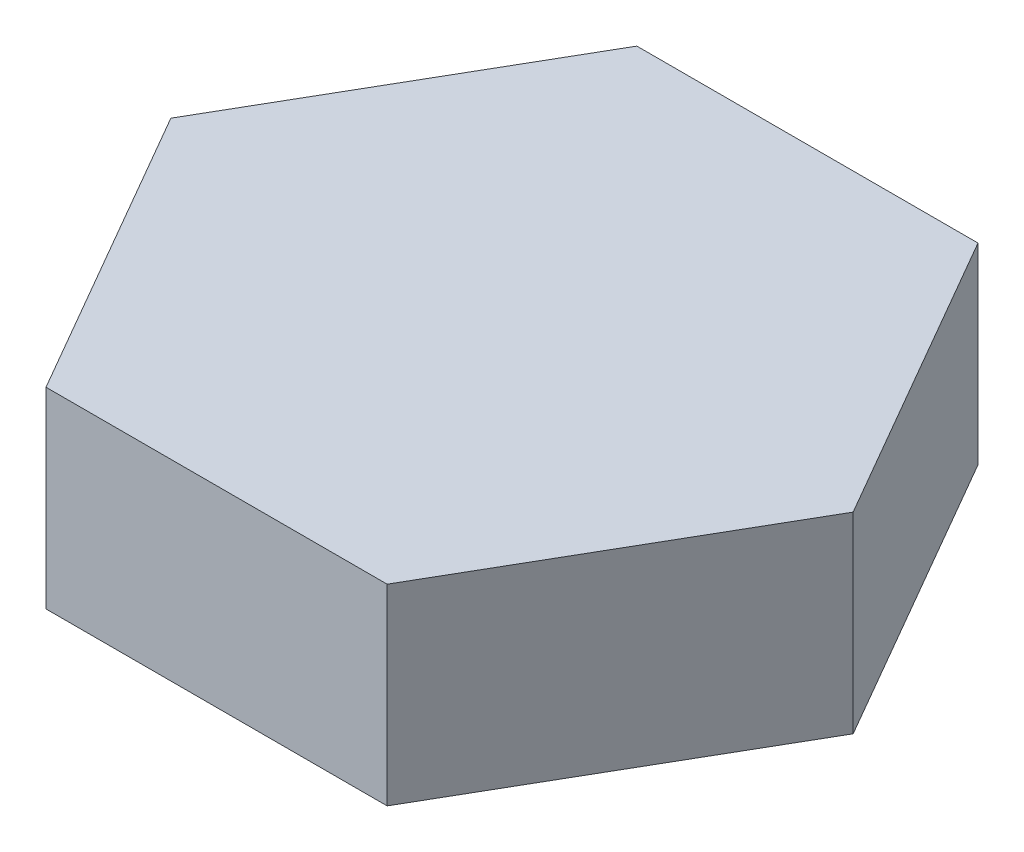
ISO-10303-21;
HEADER;
FILE_DESCRIPTION(('STEP AP214'),'2;1');
FILE_NAME('part.step','',(''),(''),'','','');
FILE_SCHEMA(('AUTOMOTIVE_DESIGN { 1 0 10303 214 1 1 1 1 }'));
ENDSEC;
DATA;
#1=APPLICATION_CONTEXT('core data for automotive mechanical design processes');
#2=APPLICATION_PROTOCOL_DEFINITION('international standard','automotive_design',2000,#1);
#3=PRODUCT_CONTEXT('',#1,'mechanical');
#4=PRODUCT('Part','Part','',(#3));
#5=PRODUCT_RELATED_PRODUCT_CATEGORY('part','',(#4));
#6=PRODUCT_DEFINITION_FORMATION('','',#4);
#7=PRODUCT_DEFINITION_CONTEXT('part definition',#1,'design');
#8=PRODUCT_DEFINITION('design','',#6,#7);
#9=PRODUCT_DEFINITION_SHAPE('','',#8);
#10=(LENGTH_UNIT() NAMED_UNIT(*) SI_UNIT(.MILLI.,.METRE.));
#11=(NAMED_UNIT(*) PLANE_ANGLE_UNIT() SI_UNIT($,.RADIAN.));
#12=(NAMED_UNIT(*) SI_UNIT($,.STERADIAN.) SOLID_ANGLE_UNIT());
#13=UNCERTAINTY_MEASURE_WITH_UNIT(LENGTH_MEASURE(1.E-05),#10,'distance_accuracy_value','');
#14=(GEOMETRIC_REPRESENTATION_CONTEXT(3) GLOBAL_UNCERTAINTY_ASSIGNED_CONTEXT((#13)) GLOBAL_UNIT_ASSIGNED_CONTEXT((#10,
#11,#12)) REPRESENTATION_CONTEXT('',''));
#15=CARTESIAN_POINT('',(0.,0.,0.));
#16=DIRECTION('',(0.,0.,1.));
#17=DIRECTION('',(1.,0.,0.));
#18=AXIS2_PLACEMENT_3D('',#15,#16,#17);
#19=CARTESIAN_POINT('',(29.3293936748329,16.51,50.8));
#20=DIRECTION('',(-0.866025403784438,0.,-0.500000000000001));
#21=DIRECTION('',(-0.500000000000001,0.,0.866025403784438));
#22=AXIS2_PLACEMENT_3D('',#19,#20,#21);
#23=PLANE('',#22);
#24=DIRECTION('',(0.500000000000001,0.,-0.866025403784438));
#25=VECTOR('',#24,1.);
#26=CARTESIAN_POINT('',(29.3293936748329,-16.51,50.8));
#27=LINE('',#26,#25);
#28=CARTESIAN_POINT('',(29.3293936748329,-16.51,50.8));
#29=VERTEX_POINT('',#28);
#30=CARTESIAN_POINT('',(58.658787349666,-16.51,0.));
#31=VERTEX_POINT('',#30);
#32=EDGE_CURVE('E117',#29,#31,#27,.T.);
#33=ORIENTED_EDGE('',*,*,#32,.T.);
#34=DIRECTION('',(0.,-1.,0.));
#35=VECTOR('',#34,1.);
#36=CARTESIAN_POINT('',(58.658787349666,16.51,0.));
#37=LINE('',#36,#35);
#38=CARTESIAN_POINT('',(58.658787349666,16.51,0.));
#39=VERTEX_POINT('',#38);
#40=EDGE_CURVE('E11',#39,#31,#37,.T.);
#41=ORIENTED_EDGE('',*,*,#40,.F.);
#42=DIRECTION('',(0.500000000000001,0.,-0.866025403784438));
#43=VECTOR('',#42,1.);
#44=CARTESIAN_POINT('',(29.3293936748329,16.51,50.8));
#45=LINE('',#44,#43);
#46=CARTESIAN_POINT('',(29.3293936748329,16.51,50.8));
#47=VERTEX_POINT('',#46);
#48=EDGE_CURVE('E127',#47,#39,#45,.T.);
#49=ORIENTED_EDGE('',*,*,#48,.F.);
#50=DIRECTION('',(0.,-1.,0.));
#51=VECTOR('',#50,1.);
#52=CARTESIAN_POINT('',(29.3293936748329,16.51,50.8));
#53=LINE('',#52,#51);
#54=EDGE_CURVE('E113',#47,#29,#53,.T.);
#55=ORIENTED_EDGE('',*,*,#54,.T.);
#56=EDGE_LOOP('',(#33,#41,#49,#55));
#57=FACE_BOUND('',#56,.T.);
#58=ADVANCED_FACE('F33',(#57),#23,.F.);
#59=CARTESIAN_POINT('',(58.658787349666,16.51,0.));
#60=DIRECTION('',(-0.866025403784439,0.,0.5));
#61=DIRECTION('',(0.5,0.,0.866025403784439));
#62=AXIS2_PLACEMENT_3D('',#59,#60,#61);
#63=PLANE('',#62);
#64=DIRECTION('',(-0.5,0.,-0.866025403784439));
#65=VECTOR('',#64,1.);
#66=CARTESIAN_POINT('',(58.658787349666,-16.51,0.));
#67=LINE('',#66,#65);
#68=CARTESIAN_POINT('',(29.329393674833,-16.51,-50.8));
#69=VERTEX_POINT('',#68);
#70=EDGE_CURVE('E120',#31,#69,#67,.T.);
#71=ORIENTED_EDGE('',*,*,#70,.T.);
#72=DIRECTION('',(0.,-1.,0.));
#73=VECTOR('',#72,1.);
#74=CARTESIAN_POINT('',(29.329393674833,16.51,-50.8));
#75=LINE('',#74,#73);
#76=CARTESIAN_POINT('',(29.329393674833,16.51,-50.8));
#77=VERTEX_POINT('',#76);
#78=EDGE_CURVE('E41',#77,#69,#75,.T.);
#79=ORIENTED_EDGE('',*,*,#78,.F.);
#80=DIRECTION('',(-0.5,0.,-0.866025403784439));
#81=VECTOR('',#80,1.);
#82=CARTESIAN_POINT('',(58.658787349666,16.51,0.));
#83=LINE('',#82,#81);
#84=EDGE_CURVE('E86',#39,#77,#83,.T.);
#85=ORIENTED_EDGE('',*,*,#84,.F.);
#86=ORIENTED_EDGE('',*,*,#40,.T.);
#87=EDGE_LOOP('',(#71,#79,#85,#86));
#88=FACE_BOUND('',#87,.T.);
#89=ADVANCED_FACE('F151',(#88),#63,.F.);
#90=CARTESIAN_POINT('',(29.329393674833,16.51,-50.8));
#91=DIRECTION('',(0.,0.,1.));
#92=DIRECTION('',(1.,0.,0.));
#93=AXIS2_PLACEMENT_3D('',#90,#91,#92);
#94=PLANE('',#93);
#95=DIRECTION('',(-1.,0.,0.));
#96=VECTOR('',#95,1.);
#97=CARTESIAN_POINT('',(29.329393674833,-16.51,-50.8));
#98=LINE('',#97,#96);
#99=CARTESIAN_POINT('',(-29.329393674833,-16.51,-50.8));
#100=VERTEX_POINT('',#99);
#101=EDGE_CURVE('E122',#69,#100,#98,.T.);
#102=ORIENTED_EDGE('',*,*,#101,.T.);
#103=DIRECTION('',(0.,-1.,0.));
#104=VECTOR('',#103,1.);
#105=CARTESIAN_POINT('',(-29.329393674833,16.51,-50.8));
#106=LINE('',#105,#104);
#107=CARTESIAN_POINT('',(-29.329393674833,16.51,-50.8));
#108=VERTEX_POINT('',#107);
#109=EDGE_CURVE('E108',#108,#100,#106,.T.);
#110=ORIENTED_EDGE('',*,*,#109,.F.);
#111=DIRECTION('',(-1.,0.,0.));
#112=VECTOR('',#111,1.);
#113=CARTESIAN_POINT('',(29.329393674833,16.51,-50.8));
#114=LINE('',#113,#112);
#115=EDGE_CURVE('E99',#77,#108,#114,.T.);
#116=ORIENTED_EDGE('',*,*,#115,.F.);
#117=ORIENTED_EDGE('',*,*,#78,.T.);
#118=EDGE_LOOP('',(#102,#110,#116,#117));
#119=FACE_BOUND('',#118,.T.);
#120=ADVANCED_FACE('F133',(#119),#94,.F.);
#121=CARTESIAN_POINT('',(-29.329393674833,16.51,-50.8));
#122=DIRECTION('',(0.866025403784439,0.,0.5));
#123=DIRECTION('',(0.5,0.,-0.866025403784439));
#124=AXIS2_PLACEMENT_3D('',#121,#122,#123);
#125=PLANE('',#124);
#126=DIRECTION('',(-0.5,0.,0.866025403784439));
#127=VECTOR('',#126,1.);
#128=CARTESIAN_POINT('',(-29.329393674833,-16.51,-50.8));
#129=LINE('',#128,#127);
#130=CARTESIAN_POINT('',(-58.658787349666,-16.51,0.));
#131=VERTEX_POINT('',#130);
#132=EDGE_CURVE('E107',#100,#131,#129,.T.);
#133=ORIENTED_EDGE('',*,*,#132,.T.);
#134=DIRECTION('',(0.,-1.,0.));
#135=VECTOR('',#134,1.);
#136=CARTESIAN_POINT('',(-58.658787349666,16.51,0.));
#137=LINE('',#136,#135);
#138=CARTESIAN_POINT('',(-58.658787349666,16.51,0.));
#139=VERTEX_POINT('',#138);
#140=EDGE_CURVE('E104',#139,#131,#137,.T.);
#141=ORIENTED_EDGE('',*,*,#140,.F.);
#142=DIRECTION('',(-0.5,0.,0.866025403784439));
#143=VECTOR('',#142,1.);
#144=CARTESIAN_POINT('',(-29.329393674833,16.51,-50.8));
#145=LINE('',#144,#143);
#146=EDGE_CURVE('E93',#108,#139,#145,.T.);
#147=ORIENTED_EDGE('',*,*,#146,.F.);
#148=ORIENTED_EDGE('',*,*,#109,.T.);
#149=EDGE_LOOP('',(#133,#141,#147,#148));
#150=FACE_BOUND('',#149,.T.);
#151=ADVANCED_FACE('F105',(#150),#125,.F.);
#152=CARTESIAN_POINT('',(-58.658787349666,16.51,0.));
#153=DIRECTION('',(0.866025403784439,0.,-0.5));
#154=DIRECTION('',(-0.5,0.,-0.866025403784439));
#155=AXIS2_PLACEMENT_3D('',#152,#153,#154);
#156=PLANE('',#155);
#157=DIRECTION('',(0.5,0.,0.866025403784439));
#158=VECTOR('',#157,1.);
#159=CARTESIAN_POINT('',(-58.658787349666,-16.51,0.));
#160=LINE('',#159,#158);
#161=CARTESIAN_POINT('',(-29.329393674833,-16.51,50.8));
#162=VERTEX_POINT('',#161);
#163=EDGE_CURVE('E72',#131,#162,#160,.T.);
#164=ORIENTED_EDGE('',*,*,#163,.T.);
#165=DIRECTION('',(0.,-1.,0.));
#166=VECTOR('',#165,1.);
#167=CARTESIAN_POINT('',(-29.329393674833,16.51,50.8));
#168=LINE('',#167,#166);
#169=CARTESIAN_POINT('',(-29.329393674833,16.51,50.8));
#170=VERTEX_POINT('',#169);
#171=EDGE_CURVE('E109',#170,#162,#168,.T.);
#172=ORIENTED_EDGE('',*,*,#171,.F.);
#173=DIRECTION('',(0.5,0.,0.866025403784439));
#174=VECTOR('',#173,1.);
#175=CARTESIAN_POINT('',(-58.658787349666,16.51,0.));
#176=LINE('',#175,#174);
#177=EDGE_CURVE('E97',#139,#170,#176,.T.);
#178=ORIENTED_EDGE('',*,*,#177,.F.);
#179=ORIENTED_EDGE('',*,*,#140,.T.);
#180=EDGE_LOOP('',(#164,#172,#178,#179));
#181=FACE_BOUND('',#180,.T.);
#182=ADVANCED_FACE('F111',(#181),#156,.F.);
#183=CARTESIAN_POINT('',(-29.329393674833,16.51,50.8));
#184=DIRECTION('',(0.,0.,-1.));
#185=DIRECTION('',(-1.,0.,0.));
#186=AXIS2_PLACEMENT_3D('',#183,#184,#185);
#187=PLANE('',#186);
#188=DIRECTION('',(1.,0.,0.));
#189=VECTOR('',#188,1.);
#190=CARTESIAN_POINT('',(-29.329393674833,-16.51,50.8));
#191=LINE('',#190,#189);
#192=EDGE_CURVE('E78',#162,#29,#191,.T.);
#193=ORIENTED_EDGE('',*,*,#192,.T.);
#194=ORIENTED_EDGE('',*,*,#54,.F.);
#195=DIRECTION('',(1.,0.,0.));
#196=VECTOR('',#195,1.);
#197=CARTESIAN_POINT('',(-29.329393674833,16.51,50.8));
#198=LINE('',#197,#196);
#199=EDGE_CURVE('E49',#170,#47,#198,.T.);
#200=ORIENTED_EDGE('',*,*,#199,.F.);
#201=ORIENTED_EDGE('',*,*,#171,.T.);
#202=EDGE_LOOP('',(#193,#194,#200,#201));
#203=FACE_BOUND('',#202,.T.);
#204=ADVANCED_FACE('F140',(#203),#187,.F.);
#205=CARTESIAN_POINT('',(0.,16.51,0.));
#206=DIRECTION('',(0.,1.,0.));
#207=DIRECTION('',(0.,0.,1.));
#208=AXIS2_PLACEMENT_3D('',#205,#206,#207);
#209=PLANE('',#208);
#210=ORIENTED_EDGE('',*,*,#48,.T.);
#211=ORIENTED_EDGE('',*,*,#84,.T.);
#212=ORIENTED_EDGE('',*,*,#115,.T.);
#213=ORIENTED_EDGE('',*,*,#146,.T.);
#214=ORIENTED_EDGE('',*,*,#177,.T.);
#215=ORIENTED_EDGE('',*,*,#199,.T.);
#216=EDGE_LOOP('',(#210,#211,#212,#213,#214,#215));
#217=FACE_BOUND('',#216,.T.);
#218=ADVANCED_FACE('F95',(#217),#209,.T.);
#219=CARTESIAN_POINT('',(0.,-16.51,0.));
#220=DIRECTION('',(0.,1.,0.));
#221=DIRECTION('',(0.,0.,1.));
#222=AXIS2_PLACEMENT_3D('',#219,#220,#221);
#223=PLANE('',#222);
#224=ORIENTED_EDGE('',*,*,#32,.F.);
#225=ORIENTED_EDGE('',*,*,#192,.F.);
#226=ORIENTED_EDGE('',*,*,#163,.F.);
#227=ORIENTED_EDGE('',*,*,#132,.F.);
#228=ORIENTED_EDGE('',*,*,#101,.F.);
#229=ORIENTED_EDGE('',*,*,#70,.F.);
#230=EDGE_LOOP('',(#224,#225,#226,#227,#228,#229));
#231=FACE_BOUND('',#230,.T.);
#232=ADVANCED_FACE('F136',(#231),#223,.F.);
#233=CLOSED_SHELL('',(#58,#89,#120,#151,#182,#204,#218,#232));
#234=MANIFOLD_SOLID_BREP('B2',#233);
#235=ADVANCED_BREP_SHAPE_REPRESENTATION('',(#18,#234),#14);
#236=SHAPE_DEFINITION_REPRESENTATION(#9,#235);
ENDSEC;
END-ISO-10303-21;
